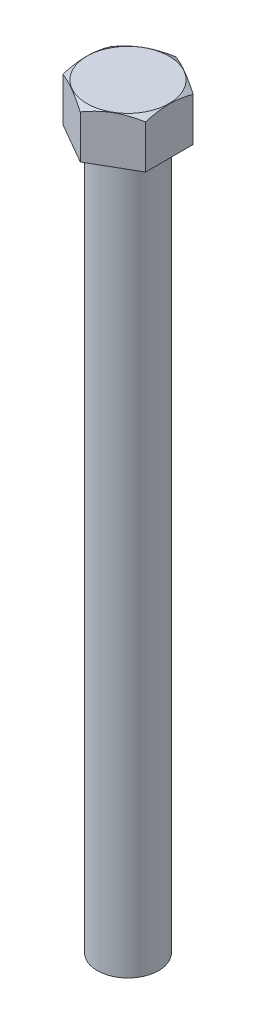
ISO-10303-21;
HEADER;
FILE_DESCRIPTION(('STEP AP214'),'2;1');
FILE_NAME('part.step','',(''),(''),'','','');
FILE_SCHEMA(('AUTOMOTIVE_DESIGN { 1 0 10303 214 1 1 1 1 }'));
ENDSEC;
DATA;
#1=APPLICATION_CONTEXT('core data for automotive mechanical design processes');
#2=APPLICATION_PROTOCOL_DEFINITION('international standard','automotive_design',2000,#1);
#3=PRODUCT_CONTEXT('',#1,'mechanical');
#4=PRODUCT('Part','Part','',(#3));
#5=PRODUCT_RELATED_PRODUCT_CATEGORY('part','',(#4));
#6=PRODUCT_DEFINITION_FORMATION('','',#4);
#7=PRODUCT_DEFINITION_CONTEXT('part definition',#1,'design');
#8=PRODUCT_DEFINITION('design','',#6,#7);
#9=PRODUCT_DEFINITION_SHAPE('','',#8);
#10=(LENGTH_UNIT() NAMED_UNIT(*) SI_UNIT(.MILLI.,.METRE.));
#11=(NAMED_UNIT(*) PLANE_ANGLE_UNIT() SI_UNIT($,.RADIAN.));
#12=(NAMED_UNIT(*) SI_UNIT($,.STERADIAN.) SOLID_ANGLE_UNIT());
#13=UNCERTAINTY_MEASURE_WITH_UNIT(LENGTH_MEASURE(1.E-05),#10,'distance_accuracy_value','');
#14=(GEOMETRIC_REPRESENTATION_CONTEXT(3) GLOBAL_UNCERTAINTY_ASSIGNED_CONTEXT((#13)) GLOBAL_UNIT_ASSIGNED_CONTEXT((#10,
#11,#12)) REPRESENTATION_CONTEXT('',''));
#15=CARTESIAN_POINT('',(0.,0.,0.));
#16=DIRECTION('',(0.,0.,1.));
#17=DIRECTION('',(1.,0.,0.));
#18=AXIS2_PLACEMENT_3D('',#15,#16,#17);
#19=CARTESIAN_POINT('',(-0.175,0.1,0.101036297108185));
#20=DIRECTION('',(0.5,0.,-0.866025403784439));
#21=DIRECTION('',(-0.866025403784439,0.,-0.5));
#22=AXIS2_PLACEMENT_3D('',#19,#20,#21);
#23=PLANE('',#22);
#24=CARTESIAN_POINT('',(-0.1752,0.0836614011452305,0.100920827054347));
#25=CARTESIAN_POINT('',(-0.167506289118401,0.0862307949351211,0.105362793102905));
#26=CARTESIAN_POINT('',(-0.15974638877836,0.0885686715971614,0.109842973653112));
#27=CARTESIAN_POINT('',(-0.14409195525207,0.0926513138512965,0.118881065063527));
#28=CARTESIAN_POINT('',(-0.136197141966122,0.0943946320833186,0.123439137639371));
#29=CARTESIAN_POINT('',(-0.120505028539456,0.0971102480020908,0.132498983550411));
#30=CARTESIAN_POINT('',(-0.112710166384676,0.0981005963846664,0.136999349313769));
#31=CARTESIAN_POINT('',(-0.0970850422874857,0.0992893177826657,0.146020518917403));
#32=CARTESIAN_POINT('',(-0.0892548358708456,0.099488666193974,0.150541290699861));
#33=CARTESIAN_POINT('',(-0.0677579493972203,0.0989085069817794,0.162952523892147));
#34=CARTESIAN_POINT('',(-0.0541030787407451,0.0972860485642891,0.170836167141412));
#35=CARTESIAN_POINT('',(-0.033721345662733,0.0932787935826537,0.182603566220554));
#36=CARTESIAN_POINT('',(-0.0268674266731297,0.0916531244675829,0.186560678194205));
#37=CARTESIAN_POINT('',(-0.0132611001757401,0.0879625084839923,0.194416294460155));
#38=CARTESIAN_POINT('',(-0.00650853221523052,0.0858983572278132,0.198314891389876));
#39=CARTESIAN_POINT('',(0.000199999999999978,0.0836614011452305,0.202188064270207));
#40=B_SPLINE_CURVE_WITH_KNOTS('',3,(#24,#25,#26,#27,#28,#29,#30,#31,#32,#33,#34,#35,#36,#37,#38,
#39),.UNSPECIFIED.,.F.,.F.,(4,2,2,2,2,2,2,4),(0.,0.0277547258420523,0.0555765418822849,
0.0827083119886983,0.109806615018668,0.157158113827718,0.181387395708681,0.205573084193857),.UNSPECIFIED.);
#41=CARTESIAN_POINT('',(-0.175,0.0837281249221059,0.101036297108185));
#42=VERTEX_POINT('',#41);
#43=CARTESIAN_POINT('',(0.,0.0837281249221066,0.202072594216368));
#44=VERTEX_POINT('',#43);
#45=EDGE_CURVE('E93',#42,#44,#40,.T.);
#46=ORIENTED_EDGE('',*,*,#45,.F.);
#47=DIRECTION('',(0.,-1.,0.));
#48=VECTOR('',#47,1.);
#49=CARTESIAN_POINT('',(-0.175,0.1,0.101036297108185));
#50=LINE('',#49,#48);
#51=CARTESIAN_POINT('',(-0.175,-0.1,0.101036297108185));
#52=VERTEX_POINT('',#51);
#53=EDGE_CURVE('E62',#42,#52,#50,.T.);
#54=ORIENTED_EDGE('',*,*,#53,.T.);
#55=DIRECTION('',(0.866025403784439,0.,0.5));
#56=VECTOR('',#55,1.);
#57=CARTESIAN_POINT('',(-0.175,-0.1,0.101036297108185));
#58=LINE('',#57,#56);
#59=CARTESIAN_POINT('',(0.,-0.1,0.202072594216369));
#60=VERTEX_POINT('',#59);
#61=EDGE_CURVE('E100',#52,#60,#58,.T.);
#62=ORIENTED_EDGE('',*,*,#61,.T.);
#63=DIRECTION('',(0.,-1.,0.));
#64=VECTOR('',#63,1.);
#65=CARTESIAN_POINT('',(0.,0.1,0.202072594216369));
#66=LINE('',#65,#64);
#67=EDGE_CURVE('E42',#44,#60,#66,.T.);
#68=ORIENTED_EDGE('',*,*,#67,.F.);
#69=EDGE_LOOP('',(#46,#54,#62,#68));
#70=FACE_BOUND('',#69,.T.);
#71=ADVANCED_FACE('F38',(#70),#23,.F.);
#72=CARTESIAN_POINT('',(0.,0.1,0.202072594216369));
#73=DIRECTION('',(-0.500000000000001,0.,-0.866025403784438));
#74=DIRECTION('',(-0.866025403784438,0.,0.500000000000001));
#75=AXIS2_PLACEMENT_3D('',#72,#73,#74);
#76=PLANE('',#75);
#77=CARTESIAN_POINT('',(-0.000200000000000025,0.0836614011452305,0.202188064270207));
#78=CARTESIAN_POINT('',(0.00749371088159883,0.0862307949351211,0.197746098221649));
#79=CARTESIAN_POINT('',(0.0152536112216399,0.0885686715971614,0.193265917671441));
#80=CARTESIAN_POINT('',(0.0309080447479305,0.0926513138512965,0.184227826261026));
#81=CARTESIAN_POINT('',(0.0388028580338776,0.0943946320833186,0.179669753685183));
#82=CARTESIAN_POINT('',(0.0544949714605439,0.0971102480020908,0.170609907774143));
#83=CARTESIAN_POINT('',(0.0622898336153237,0.0981005963846664,0.166109542010785));
#84=CARTESIAN_POINT('',(0.0779149577125144,0.0992893177826658,0.157088372407151));
#85=CARTESIAN_POINT('',(0.0857451641291544,0.099488666193974,0.152567600624693));
#86=CARTESIAN_POINT('',(0.10724205060278,0.0989085069817795,0.140156367432407));
#87=CARTESIAN_POINT('',(0.120896921259255,0.0972860485642892,0.132272724183141));
#88=CARTESIAN_POINT('',(0.141278654337267,0.0932787935826538,0.120505325104));
#89=CARTESIAN_POINT('',(0.14813257332687,0.0916531244675829,0.116548213130348));
#90=CARTESIAN_POINT('',(0.16173889982426,0.0879625084839924,0.108692596864399));
#91=CARTESIAN_POINT('',(0.16849146778477,0.0858983572278132,0.104793999934677));
#92=CARTESIAN_POINT('',(0.1752,0.0836614011452305,0.100920827054346));
#93=B_SPLINE_CURVE_WITH_KNOTS('',3,(#77,#78,#79,#80,#81,#82,#83,#84,#85,#86,#87,#88,#89,#90,#91,
#92),.UNSPECIFIED.,.F.,.F.,(4,2,2,2,2,2,2,4),(0.,0.0277547258420524,0.0555765418822849,
0.0827083119886983,0.109806615018668,0.157158113827718,0.181387395708681,0.205573084193857),.UNSPECIFIED.);
#94=CARTESIAN_POINT('',(0.175,0.0837281249221059,0.101036297108184));
#95=VERTEX_POINT('',#94);
#96=EDGE_CURVE('E101',#44,#95,#93,.T.);
#97=ORIENTED_EDGE('',*,*,#96,.F.);
#98=ORIENTED_EDGE('',*,*,#67,.T.);
#99=DIRECTION('',(0.866025403784438,0.,-0.500000000000001));
#100=VECTOR('',#99,1.);
#101=CARTESIAN_POINT('',(0.,-0.1,0.202072594216369));
#102=LINE('',#101,#100);
#103=CARTESIAN_POINT('',(0.175,-0.1,0.101036297108184));
#104=VERTEX_POINT('',#103);
#105=EDGE_CURVE('E126',#60,#104,#102,.T.);
#106=ORIENTED_EDGE('',*,*,#105,.T.);
#107=DIRECTION('',(0.,-1.,0.));
#108=VECTOR('',#107,1.);
#109=CARTESIAN_POINT('',(0.175,0.1,0.101036297108184));
#110=LINE('',#109,#108);
#111=EDGE_CURVE('E117',#95,#104,#110,.T.);
#112=ORIENTED_EDGE('',*,*,#111,.F.);
#113=EDGE_LOOP('',(#97,#98,#106,#112));
#114=FACE_BOUND('',#113,.T.);
#115=ADVANCED_FACE('F125',(#114),#76,.F.);
#116=CARTESIAN_POINT('',(0.175,0.1,0.101036297108184));
#117=DIRECTION('',(-1.,0.,0.));
#118=DIRECTION('',(0.,0.,1.));
#119=AXIS2_PLACEMENT_3D('',#116,#117,#118);
#120=PLANE('',#119);
#121=CARTESIAN_POINT('',(0.175,-0.0425679304653176,0.382710926057514));
#122=CARTESIAN_POINT('',(0.175,-0.0333498132165488,0.365133840671508));
#123=CARTESIAN_POINT('',(0.175,-0.0242008123590792,0.347518607434324));
#124=CARTESIAN_POINT('',(0.175,-0.00614771106855244,0.31213297611311));
#125=CARTESIAN_POINT('',(0.175,0.00275603608185779,0.294362398278862));
#126=CARTESIAN_POINT('',(0.175,0.0206851644952984,0.257611999295663));
#127=CARTESIAN_POINT('',(0.175,0.0296883038256113,0.238621214205248));
#128=CARTESIAN_POINT('',(0.175,0.0469756854029287,0.20032320747581));
#129=CARTESIAN_POINT('',(0.175,0.0552603368134454,0.181016173481545));
#130=CARTESIAN_POINT('',(0.175,0.071387774705537,0.139864202673842));
#131=CARTESIAN_POINT('',(0.175,0.0790948782598583,0.11796423229844));
#132=CARTESIAN_POINT('',(0.175,0.091310399790263,0.0736905076344693));
#133=CARTESIAN_POINT('',(0.175,0.0958851793725223,0.0513376360623179));
#134=CARTESIAN_POINT('',(0.175,0.0990860080956377,0.0172168404994544));
#135=CARTESIAN_POINT('',(0.175,0.0995280428353157,0.00562545514892134));
#136=CARTESIAN_POINT('',(0.175,0.0990720955757112,-0.0175298535061386));
#137=CARTESIAN_POINT('',(0.175,0.0981740723729209,-0.0290937759552982));
#138=CARTESIAN_POINT('',(0.175,0.0951490431470938,-0.0523132726392057));
#139=CARTESIAN_POINT('',(0.175,0.0929952266688708,-0.0639651931489011));
#140=CARTESIAN_POINT('',(0.175,0.0877151801342592,-0.0870464994262573));
#141=CARTESIAN_POINT('',(0.175,0.0845882917190126,-0.0984757289462486));
#142=CARTESIAN_POINT('',(0.175,0.0735393714908248,-0.134527998250772));
#143=CARTESIAN_POINT('',(0.175,0.0643245545303879,-0.158743905384145));
#144=CARTESIAN_POINT('',(0.175,0.0443792319539172,-0.206553659365649));
#145=CARTESIAN_POINT('',(0.175,0.033645610263367,-0.230146105941561));
#146=CARTESIAN_POINT('',(0.175,0.0121528931724112,-0.275380100316232));
#147=CARTESIAN_POINT('',(0.175,0.00144451304180508,-0.297045764706263));
#148=CARTESIAN_POINT('',(0.175,-0.0203392355402586,-0.340060860756979));
#149=CARTESIAN_POINT('',(0.175,-0.0314125724693052,-0.361411316457497));
#150=CARTESIAN_POINT('',(0.175,-0.0425679304653177,-0.382710926057515));
#151=B_SPLINE_CURVE_WITH_KNOTS('',3,(#121,#122,#123,#124,#125,#126,#127,#128,#129,#130,#131,
#132,#133,#134,#135,#136,#137,#138,#139,#140,#141,#142,#143,#144,#145,#146,#147,#148,#149,#150),
.UNSPECIFIED.,.F.,.F.,(4,2,2,2,2,2,2,2,2,2,2,2,2,2,4),(0.,0.059545180709738,0.119172070050907,
0.182214119097374,0.245220028014211,0.314782106403902,0.382820610046379,0.417542868457835,
0.452266194515901,0.487759491251735,0.523276854365782,0.600863336329529,0.678611371962546,
0.751106633294611,0.823250332458085),.UNSPECIFIED.);
#152=CARTESIAN_POINT('',(0.174999999999999,0.0837281249221066,-0.101036297108185));
#153=VERTEX_POINT('',#152);
#154=EDGE_CURVE('E155',#95,#153,#151,.T.);
#155=ORIENTED_EDGE('',*,*,#154,.F.);
#156=ORIENTED_EDGE('',*,*,#111,.T.);
#157=DIRECTION('',(0.,0.,-1.));
#158=VECTOR('',#157,1.);
#159=CARTESIAN_POINT('',(0.175,-0.1,0.101036297108184));
#160=LINE('',#159,#158);
#161=CARTESIAN_POINT('',(0.175,-0.1,-0.101036297108185));
#162=VERTEX_POINT('',#161);
#163=EDGE_CURVE('E131',#104,#162,#160,.T.);
#164=ORIENTED_EDGE('',*,*,#163,.T.);
#165=DIRECTION('',(0.,-1.,0.));
#166=VECTOR('',#165,1.);
#167=CARTESIAN_POINT('',(0.175,0.1,-0.101036297108185));
#168=LINE('',#167,#166);
#169=EDGE_CURVE('E116',#153,#162,#168,.T.);
#170=ORIENTED_EDGE('',*,*,#169,.F.);
#171=EDGE_LOOP('',(#155,#156,#164,#170));
#172=FACE_BOUND('',#171,.T.);
#173=ADVANCED_FACE('F154',(#172),#120,.F.);
#174=CARTESIAN_POINT('',(0.175,0.1,-0.101036297108185));
#175=DIRECTION('',(-0.5,0.,0.866025403784439));
#176=DIRECTION('',(0.866025403784439,0.,0.5));
#177=AXIS2_PLACEMENT_3D('',#174,#175,#176);
#178=PLANE('',#177);
#179=CARTESIAN_POINT('',(0.1752,0.0836614011452305,-0.100920827054347));
#180=CARTESIAN_POINT('',(0.167506289118401,0.0862307949351211,-0.105362793102905));
#181=CARTESIAN_POINT('',(0.15974638877836,0.0885686715971614,-0.109842973653112));
#182=CARTESIAN_POINT('',(0.14409195525207,0.0926513138512965,-0.118881065063527));
#183=CARTESIAN_POINT('',(0.136197141966122,0.0943946320833186,-0.123439137639371));
#184=CARTESIAN_POINT('',(0.120505028539456,0.0971102480020908,-0.132498983550411));
#185=CARTESIAN_POINT('',(0.112710166384676,0.0981005963846664,-0.136999349313769));
#186=CARTESIAN_POINT('',(0.0970850422874856,0.0992893177826657,-0.146020518917403));
#187=CARTESIAN_POINT('',(0.0892548358708455,0.099488666193974,-0.150541290699861));
#188=CARTESIAN_POINT('',(0.0677579493972202,0.0989085069817794,-0.162952523892147));
#189=CARTESIAN_POINT('',(0.0541030787407451,0.0972860485642891,-0.170836167141412));
#190=CARTESIAN_POINT('',(0.033721345662733,0.0932787935826537,-0.182603566220554));
#191=CARTESIAN_POINT('',(0.0268674266731297,0.0916531244675829,-0.186560678194205));
#192=CARTESIAN_POINT('',(0.0132611001757402,0.0879625084839923,-0.194416294460155));
#193=CARTESIAN_POINT('',(0.00650853221523054,0.0858983572278132,-0.198314891389876));
#194=CARTESIAN_POINT('',(-0.000200000000000004,0.0836614011452305,-0.202188064270207));
#195=B_SPLINE_CURVE_WITH_KNOTS('',3,(#179,#180,#181,#182,#183,#184,#185,#186,#187,#188,#189,
#190,#191,#192,#193,#194),.UNSPECIFIED.,.F.,.F.,(4,2,2,2,2,2,2,4),(0.,0.0277547258420524,
0.0555765418822849,0.0827083119886982,0.109806615018668,0.157158113827718,0.181387395708681,
0.205573084193857),.UNSPECIFIED.);
#196=CARTESIAN_POINT('',(0.,0.0837281249221066,-0.202072594216368));
#197=VERTEX_POINT('',#196);
#198=EDGE_CURVE('E153',#153,#197,#195,.T.);
#199=ORIENTED_EDGE('',*,*,#198,.F.);
#200=ORIENTED_EDGE('',*,*,#169,.T.);
#201=DIRECTION('',(-0.866025403784439,0.,-0.5));
#202=VECTOR('',#201,1.);
#203=CARTESIAN_POINT('',(0.175,-0.1,-0.101036297108185));
#204=LINE('',#203,#202);
#205=CARTESIAN_POINT('',(0.,-0.1,-0.202072594216369));
#206=VERTEX_POINT('',#205);
#207=EDGE_CURVE('E142',#162,#206,#204,.T.);
#208=ORIENTED_EDGE('',*,*,#207,.T.);
#209=DIRECTION('',(0.,-1.,0.));
#210=VECTOR('',#209,1.);
#211=CARTESIAN_POINT('',(0.,0.1,-0.202072594216369));
#212=LINE('',#211,#210);
#213=EDGE_CURVE('E109',#197,#206,#212,.T.);
#214=ORIENTED_EDGE('',*,*,#213,.F.);
#215=EDGE_LOOP('',(#199,#200,#208,#214));
#216=FACE_BOUND('',#215,.T.);
#217=ADVANCED_FACE('F151',(#216),#178,.F.);
#218=CARTESIAN_POINT('',(0.,0.1,-0.202072594216369));
#219=DIRECTION('',(0.5,0.,0.866025403784438));
#220=DIRECTION('',(0.866025403784438,0.,-0.5));
#221=AXIS2_PLACEMENT_3D('',#218,#219,#220);
#222=PLANE('',#221);
#223=CARTESIAN_POINT('',(0.000199999999999971,0.0836614011452305,-0.202188064270207));
#224=CARTESIAN_POINT('',(-0.00749371088159889,0.0862307949351211,-0.197746098221649));
#225=CARTESIAN_POINT('',(-0.0152536112216399,0.0885686715971614,-0.193265917671441));
#226=CARTESIAN_POINT('',(-0.0309080447479305,0.0926513138512965,-0.184227826261026));
#227=CARTESIAN_POINT('',(-0.0388028580338777,0.0943946320833186,-0.179669753685183));
#228=CARTESIAN_POINT('',(-0.054494971460544,0.0971102480020908,-0.170609907774143));
#229=CARTESIAN_POINT('',(-0.0622898336153238,0.0981005963846664,-0.166109542010785));
#230=CARTESIAN_POINT('',(-0.0779149577125144,0.0992893177826657,-0.157088372407151));
#231=CARTESIAN_POINT('',(-0.0857451641291545,0.099488666193974,-0.152567600624693));
#232=CARTESIAN_POINT('',(-0.10724205060278,0.0989085069817794,-0.140156367432407));
#233=CARTESIAN_POINT('',(-0.120896921259255,0.0972860485642891,-0.132272724183141));
#234=CARTESIAN_POINT('',(-0.141278654337267,0.0932787935826537,-0.120505325104));
#235=CARTESIAN_POINT('',(-0.14813257332687,0.0916531244675829,-0.116548213130348));
#236=CARTESIAN_POINT('',(-0.16173889982426,0.0879625084839923,-0.108692596864399));
#237=CARTESIAN_POINT('',(-0.16849146778477,0.0858983572278132,-0.104793999934677));
#238=CARTESIAN_POINT('',(-0.1752,0.0836614011452305,-0.100920827054347));
#239=B_SPLINE_CURVE_WITH_KNOTS('',3,(#223,#224,#225,#226,#227,#228,#229,#230,#231,#232,#233,
#234,#235,#236,#237,#238),.UNSPECIFIED.,.F.,.F.,(4,2,2,2,2,2,2,4),(0.,0.0277547258420524,
0.0555765418822849,0.0827083119886983,0.109806615018668,0.157158113827718,0.181387395708681,
0.205573084193857),.UNSPECIFIED.);
#240=CARTESIAN_POINT('',(-0.175,0.0837281249221059,-0.101036297108184));
#241=VERTEX_POINT('',#240);
#242=EDGE_CURVE('E54',#197,#241,#239,.T.);
#243=ORIENTED_EDGE('',*,*,#242,.F.);
#244=ORIENTED_EDGE('',*,*,#213,.T.);
#245=DIRECTION('',(-0.866025403784438,0.,0.5));
#246=VECTOR('',#245,1.);
#247=CARTESIAN_POINT('',(0.,-0.1,-0.202072594216369));
#248=LINE('',#247,#246);
#249=CARTESIAN_POINT('',(-0.175,-0.1,-0.101036297108184));
#250=VERTEX_POINT('',#249);
#251=EDGE_CURVE('E111',#206,#250,#248,.T.);
#252=ORIENTED_EDGE('',*,*,#251,.T.);
#253=DIRECTION('',(0.,-1.,0.));
#254=VECTOR('',#253,1.);
#255=CARTESIAN_POINT('',(-0.175,0.1,-0.101036297108184));
#256=LINE('',#255,#254);
#257=EDGE_CURVE('E107',#241,#250,#256,.T.);
#258=ORIENTED_EDGE('',*,*,#257,.F.);
#259=EDGE_LOOP('',(#243,#244,#252,#258));
#260=FACE_BOUND('',#259,.T.);
#261=ADVANCED_FACE('F147',(#260),#222,.F.);
#262=CARTESIAN_POINT('',(-0.175,0.1,-0.101036297108184));
#263=DIRECTION('',(1.,0.,0.));
#264=DIRECTION('',(0.,0.,-1.));
#265=AXIS2_PLACEMENT_3D('',#262,#263,#264);
#266=PLANE('',#265);
#267=CARTESIAN_POINT('',(-0.175,-0.0425679304653177,-0.382710926057514));
#268=CARTESIAN_POINT('',(-0.175,-0.0333498132165489,-0.365133840671508));
#269=CARTESIAN_POINT('',(-0.175,-0.0242008123590793,-0.347518607434324));
#270=CARTESIAN_POINT('',(-0.175,-0.00614771106855248,-0.31213297611311));
#271=CARTESIAN_POINT('',(-0.175,0.00275603608185775,-0.294362398278862));
#272=CARTESIAN_POINT('',(-0.175,0.0206851644952984,-0.257611999295663));
#273=CARTESIAN_POINT('',(-0.175,0.0296883038256112,-0.238621214205248));
#274=CARTESIAN_POINT('',(-0.175,0.0469756854029287,-0.20032320747581));
#275=CARTESIAN_POINT('',(-0.175,0.0552603368134454,-0.181016173481545));
#276=CARTESIAN_POINT('',(-0.175,0.071387774705537,-0.139864202673842));
#277=CARTESIAN_POINT('',(-0.175,0.0790948782598583,-0.11796423229844));
#278=CARTESIAN_POINT('',(-0.175,0.0913103997902629,-0.0736905076344694));
#279=CARTESIAN_POINT('',(-0.175,0.0958851793725223,-0.051337636062318));
#280=CARTESIAN_POINT('',(-0.175,0.0990860080956376,-0.0172168404994545));
#281=CARTESIAN_POINT('',(-0.175,0.0995280428353157,-0.00562545514892137));
#282=CARTESIAN_POINT('',(-0.175,0.0990720955757112,0.0175298535061386));
#283=CARTESIAN_POINT('',(-0.175,0.0981740723729209,0.0290937759552981));
#284=CARTESIAN_POINT('',(-0.175,0.0951490431470938,0.0523132726392057));
#285=CARTESIAN_POINT('',(-0.175,0.0929952266688708,0.063965193148901));
#286=CARTESIAN_POINT('',(-0.175,0.0877151801342592,0.0870464994262572));
#287=CARTESIAN_POINT('',(-0.175,0.0845882917190125,0.0984757289462486));
#288=CARTESIAN_POINT('',(-0.175,0.0735393714908248,0.134527998250772));
#289=CARTESIAN_POINT('',(-0.175,0.0643245545303879,0.158743905384145));
#290=CARTESIAN_POINT('',(-0.175,0.0443792319539172,0.206553659365649));
#291=CARTESIAN_POINT('',(-0.175,0.033645610263367,0.230146105941561));
#292=CARTESIAN_POINT('',(-0.175,0.0121528931724112,0.275380100316232));
#293=CARTESIAN_POINT('',(-0.175,0.0014445130418051,0.297045764706263));
#294=CARTESIAN_POINT('',(-0.175,-0.0203392355402586,0.340060860756979));
#295=CARTESIAN_POINT('',(-0.175,-0.0314125724693052,0.361411316457497));
#296=CARTESIAN_POINT('',(-0.175,-0.0425679304653177,0.382710926057515));
#297=B_SPLINE_CURVE_WITH_KNOTS('',3,(#267,#268,#269,#270,#271,#272,#273,#274,#275,#276,#277,
#278,#279,#280,#281,#282,#283,#284,#285,#286,#287,#288,#289,#290,#291,#292,#293,#294,#295,#296),
.UNSPECIFIED.,.F.,.F.,(4,2,2,2,2,2,2,2,2,2,2,2,2,2,4),(0.,0.059545180709738,0.119172070050907,
0.182214119097374,0.245220028014211,0.314782106403902,0.382820610046379,0.417542868457835,
0.452266194515901,0.487759491251735,0.523276854365782,0.600863336329529,0.678611371962546,
0.751106633294611,0.823250332458085),.UNSPECIFIED.);
#298=EDGE_CURVE('E91',#241,#42,#297,.T.);
#299=ORIENTED_EDGE('',*,*,#298,.F.);
#300=ORIENTED_EDGE('',*,*,#257,.T.);
#301=DIRECTION('',(0.,0.,1.));
#302=VECTOR('',#301,1.);
#303=CARTESIAN_POINT('',(-0.175,-0.1,-0.101036297108184));
#304=LINE('',#303,#302);
#305=EDGE_CURVE('E105',#250,#52,#304,.T.);
#306=ORIENTED_EDGE('',*,*,#305,.T.);
#307=ORIENTED_EDGE('',*,*,#53,.F.);
#308=EDGE_LOOP('',(#299,#300,#306,#307));
#309=FACE_BOUND('',#308,.T.);
#310=ADVANCED_FACE('F103',(#309),#266,.F.);
#311=CARTESIAN_POINT('',(0.,-0.1,0.));
#312=DIRECTION('',(0.,1.,0.));
#313=DIRECTION('',(0.,0.,1.));
#314=AXIS2_PLACEMENT_3D('',#311,#312,#313);
#315=PLANE('',#314);
#316=CARTESIAN_POINT('',(0.,-0.1,0.));
#317=DIRECTION('',(0.,-1.,0.));
#318=DIRECTION('',(0.,0.,-1.));
#319=AXIS2_PLACEMENT_3D('',#316,#317,#318);
#320=CIRCLE('',#319,0.13);
#321=CARTESIAN_POINT('',(0.,-0.1,-0.13));
#322=VERTEX_POINT('',#321);
#323=EDGE_CURVE('E12',#322,#322,#320,.T.);
#324=ORIENTED_EDGE('',*,*,#323,.F.);
#325=EDGE_LOOP('',(#324));
#326=FACE_BOUND('',#325,.T.);
#327=ORIENTED_EDGE('',*,*,#61,.F.);
#328=ORIENTED_EDGE('',*,*,#305,.F.);
#329=ORIENTED_EDGE('',*,*,#251,.F.);
#330=ORIENTED_EDGE('',*,*,#207,.F.);
#331=ORIENTED_EDGE('',*,*,#163,.F.);
#332=ORIENTED_EDGE('',*,*,#105,.F.);
#333=EDGE_LOOP('',(#327,#328,#329,#330,#331,#332));
#334=FACE_BOUND('',#333,.T.);
#335=ADVANCED_FACE('F129',(#326,#334),#315,.F.);
#336=CARTESIAN_POINT('',(0.,0.1,0.));
#337=DIRECTION('',(0.,-1.,0.));
#338=DIRECTION('',(0.,0.,1.));
#339=AXIS2_PLACEMENT_3D('',#336,#337,#338);
#340=CONICAL_SURFACE('',#339,0.173888879847043,1.0471975511966);
#341=CARTESIAN_POINT('',(0.,0.1,0.));
#342=DIRECTION('',(0.,1.,0.));
#343=DIRECTION('',(0.,0.,1.));
#344=AXIS2_PLACEMENT_3D('',#341,#342,#343);
#345=CIRCLE('',#344,0.173888879847043);
#346=CARTESIAN_POINT('',(0.,0.1,0.173888879847043));
#347=VERTEX_POINT('',#346);
#348=EDGE_CURVE('E97',#347,#347,#345,.T.);
#349=ORIENTED_EDGE('',*,*,#348,.F.);
#350=EDGE_LOOP('',(#349));
#351=FACE_BOUND('',#350,.T.);
#352=ORIENTED_EDGE('',*,*,#45,.T.);
#353=ORIENTED_EDGE('',*,*,#96,.T.);
#354=ORIENTED_EDGE('',*,*,#154,.T.);
#355=ORIENTED_EDGE('',*,*,#198,.T.);
#356=ORIENTED_EDGE('',*,*,#242,.T.);
#357=ORIENTED_EDGE('',*,*,#298,.T.);
#358=EDGE_LOOP('',(#352,#353,#354,#355,#356,#357));
#359=FACE_BOUND('',#358,.T.);
#360=ADVANCED_FACE('F92',(#351,#359),#340,.T.);
#361=CARTESIAN_POINT('',(0.,0.1,0.));
#362=DIRECTION('',(0.,1.,0.));
#363=DIRECTION('',(0.,0.,1.));
#364=AXIS2_PLACEMENT_3D('',#361,#362,#363);
#365=PLANE('',#364);
#366=ORIENTED_EDGE('',*,*,#348,.T.);
#367=EDGE_LOOP('',(#366));
#368=FACE_BOUND('',#367,.T.);
#369=ADVANCED_FACE('F208',(#368),#365,.T.);
#370=CARTESIAN_POINT('',(0.,-3.1,0.));
#371=DIRECTION('',(0.,1.,0.));
#372=DIRECTION('',(0.,0.,1.));
#373=AXIS2_PLACEMENT_3D('',#370,#371,#372);
#374=CYLINDRICAL_SURFACE('',#373,0.13);
#375=CARTESIAN_POINT('',(0.,-3.1,0.));
#376=DIRECTION('',(0.,-1.,0.));
#377=DIRECTION('',(0.,0.,-1.));
#378=AXIS2_PLACEMENT_3D('',#375,#376,#377);
#379=CIRCLE('',#378,0.13);
#380=CARTESIAN_POINT('',(0.,-3.1,-0.13));
#381=VERTEX_POINT('',#380);
#382=EDGE_CURVE('E307',#381,#381,#379,.T.);
#383=ORIENTED_EDGE('',*,*,#382,.F.);
#384=EDGE_LOOP('',(#383));
#385=FACE_BOUND('',#384,.T.);
#386=ORIENTED_EDGE('',*,*,#323,.T.);
#387=EDGE_LOOP('',(#386));
#388=FACE_BOUND('',#387,.T.);
#389=ADVANCED_FACE('F219',(#385,#388),#374,.T.);
#390=CARTESIAN_POINT('',(0.,-3.1,0.));
#391=DIRECTION('',(0.,-1.,0.));
#392=DIRECTION('',(0.,0.,-1.));
#393=AXIS2_PLACEMENT_3D('',#390,#391,#392);
#394=PLANE('',#393);
#395=ORIENTED_EDGE('',*,*,#382,.T.);
#396=EDGE_LOOP('',(#395));
#397=FACE_BOUND('',#396,.T.);
#398=ADVANCED_FACE('F237',(#397),#394,.T.);
#399=CLOSED_SHELL('',(#71,#115,#173,#217,#261,#310,#335,#360,#369,#389,#398));
#400=MANIFOLD_SOLID_BREP('B2',#399);
#401=ADVANCED_BREP_SHAPE_REPRESENTATION('',(#18,#400),#14);
#402=SHAPE_DEFINITION_REPRESENTATION(#9,#401);
ENDSEC;
END-ISO-10303-21;
